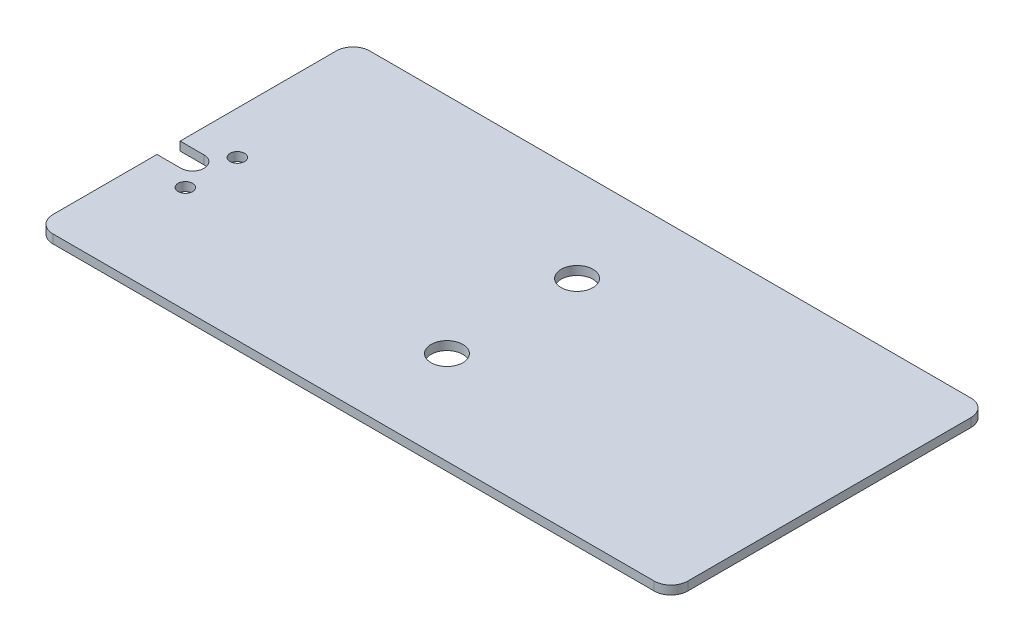
ISO-10303-21;
HEADER;
FILE_DESCRIPTION(('STEP AP214'),'2;1');
FILE_NAME('part.step','',(''),(''),'','','');
FILE_SCHEMA(('AUTOMOTIVE_DESIGN { 1 0 10303 214 1 1 1 1 }'));
ENDSEC;
DATA;
#1=APPLICATION_CONTEXT('core data for automotive mechanical design processes');
#2=APPLICATION_PROTOCOL_DEFINITION('international standard','automotive_design',2000,#1);
#3=PRODUCT_CONTEXT('',#1,'mechanical');
#4=PRODUCT('Part','Part','',(#3));
#5=PRODUCT_RELATED_PRODUCT_CATEGORY('part','',(#4));
#6=PRODUCT_DEFINITION_FORMATION('','',#4);
#7=PRODUCT_DEFINITION_CONTEXT('part definition',#1,'design');
#8=PRODUCT_DEFINITION('design','',#6,#7);
#9=PRODUCT_DEFINITION_SHAPE('','',#8);
#10=(LENGTH_UNIT() NAMED_UNIT(*) SI_UNIT(.MILLI.,.METRE.));
#11=(NAMED_UNIT(*) PLANE_ANGLE_UNIT() SI_UNIT($,.RADIAN.));
#12=(NAMED_UNIT(*) SI_UNIT($,.STERADIAN.) SOLID_ANGLE_UNIT());
#13=UNCERTAINTY_MEASURE_WITH_UNIT(LENGTH_MEASURE(1.E-05),#10,'distance_accuracy_value','');
#14=(GEOMETRIC_REPRESENTATION_CONTEXT(3) GLOBAL_UNCERTAINTY_ASSIGNED_CONTEXT((#13)) GLOBAL_UNIT_ASSIGNED_CONTEXT((#10,
#11,#12)) REPRESENTATION_CONTEXT('',''));
#15=CARTESIAN_POINT('',(0.,0.,0.));
#16=DIRECTION('',(0.,0.,1.));
#17=DIRECTION('',(1.,0.,0.));
#18=AXIS2_PLACEMENT_3D('',#15,#16,#17);
#19=CARTESIAN_POINT('',(0.,0.,0.));
#20=DIRECTION('',(0.,-1.,0.));
#21=DIRECTION('',(0.,0.,-1.));
#22=AXIS2_PLACEMENT_3D('',#19,#20,#21);
#23=PLANE('',#22);
#24=CARTESIAN_POINT('',(0.,0.,-22.5));
#25=DIRECTION('',(0.,1.,0.));
#26=DIRECTION('',(0.,0.,1.));
#27=AXIS2_PLACEMENT_3D('',#24,#25,#26);
#28=CIRCLE('',#27,5.5);
#29=CARTESIAN_POINT('',(0.,0.,-17.));
#30=VERTEX_POINT('',#29);
#31=EDGE_CURVE('E155',#30,#30,#28,.T.);
#32=ORIENTED_EDGE('',*,*,#31,.T.);
#33=EDGE_LOOP('',(#32));
#34=FACE_BOUND('',#33,.T.);
#35=CARTESIAN_POINT('',(0.,0.,22.5));
#36=DIRECTION('',(0.,1.,0.));
#37=DIRECTION('',(0.,0.,1.));
#38=AXIS2_PLACEMENT_3D('',#35,#36,#37);
#39=CIRCLE('',#38,5.5);
#40=CARTESIAN_POINT('',(0.,0.,28.));
#41=VERTEX_POINT('',#40);
#42=EDGE_CURVE('E313',#41,#41,#39,.T.);
#43=ORIENTED_EDGE('',*,*,#42,.T.);
#44=EDGE_LOOP('',(#43));
#45=FACE_BOUND('',#44,.T.);
#46=CARTESIAN_POINT('',(-95.,0.,0.));
#47=DIRECTION('',(0.,1.,0.));
#48=DIRECTION('',(0.,0.,1.));
#49=AXIS2_PLACEMENT_3D('',#46,#47,#48);
#50=CIRCLE('',#49,2.49999999999999);
#51=CARTESIAN_POINT('',(-95.,0.,2.5));
#52=VERTEX_POINT('',#51);
#53=EDGE_CURVE('E167',#52,#52,#50,.T.);
#54=ORIENTED_EDGE('',*,*,#53,.T.);
#55=EDGE_LOOP('',(#54));
#56=FACE_BOUND('',#55,.T.);
#57=CARTESIAN_POINT('',(-95.,0.,18.));
#58=DIRECTION('',(0.,1.,0.));
#59=DIRECTION('',(0.,0.,1.));
#60=AXIS2_PLACEMENT_3D('',#57,#58,#59);
#61=CIRCLE('',#60,2.49999999999999);
#62=CARTESIAN_POINT('',(-95.,0.,20.5));
#63=VERTEX_POINT('',#62);
#64=EDGE_CURVE('E326',#63,#63,#61,.T.);
#65=ORIENTED_EDGE('',*,*,#64,.T.);
#66=EDGE_LOOP('',(#65));
#67=FACE_BOUND('',#66,.T.);
#68=DIRECTION('',(0.,0.,-1.));
#69=VECTOR('',#68,1.);
#70=CARTESIAN_POINT('',(-109.8,0.,0.));
#71=LINE('',#70,#69);
#72=CARTESIAN_POINT('',(-109.8,0.,49.));
#73=VERTEX_POINT('',#72);
#74=CARTESIAN_POINT('',(-109.8,0.,13.));
#75=VERTEX_POINT('',#74);
#76=EDGE_CURVE('E144',#73,#75,#71,.T.);
#77=ORIENTED_EDGE('',*,*,#76,.T.);
#78=DIRECTION('',(-1.,0.,0.));
#79=VECTOR('',#78,1.);
#80=CARTESIAN_POINT('',(0.,0.,13.));
#81=LINE('',#80,#79);
#82=CARTESIAN_POINT('',(-101.5,0.,13.));
#83=VERTEX_POINT('',#82);
#84=EDGE_CURVE('E126',#83,#75,#81,.T.);
#85=ORIENTED_EDGE('',*,*,#84,.F.);
#86=CARTESIAN_POINT('',(-101.5,0.,9.00000000000001));
#87=DIRECTION('',(0.,1.,0.));
#88=DIRECTION('',(0.,0.,1.));
#89=AXIS2_PLACEMENT_3D('',#86,#87,#88);
#90=CIRCLE('',#89,4.);
#91=CARTESIAN_POINT('',(-101.5,0.,5.));
#92=VERTEX_POINT('',#91);
#93=EDGE_CURVE('E135',#83,#92,#90,.T.);
#94=ORIENTED_EDGE('',*,*,#93,.T.);
#95=DIRECTION('',(-1.,0.,0.));
#96=VECTOR('',#95,1.);
#97=CARTESIAN_POINT('',(0.,0.,5.));
#98=LINE('',#97,#96);
#99=CARTESIAN_POINT('',(-109.8,0.,5.));
#100=VERTEX_POINT('',#99);
#101=EDGE_CURVE('E132',#92,#100,#98,.T.);
#102=ORIENTED_EDGE('',*,*,#101,.T.);
#103=CARTESIAN_POINT('',(-109.8,0.,-49.));
#104=VERTEX_POINT('',#103);
#105=EDGE_CURVE('E173',#100,#104,#71,.T.);
#106=ORIENTED_EDGE('',*,*,#105,.T.);
#107=CARTESIAN_POINT('',(-104.,0.,-49.));
#108=DIRECTION('',(0.,-1.,0.));
#109=DIRECTION('',(0.,0.,-1.));
#110=AXIS2_PLACEMENT_3D('',#107,#108,#109);
#111=CIRCLE('',#110,5.8);
#112=CARTESIAN_POINT('',(-104.,0.,-54.8));
#113=VERTEX_POINT('',#112);
#114=EDGE_CURVE('E170',#104,#113,#111,.T.);
#115=ORIENTED_EDGE('',*,*,#114,.T.);
#116=DIRECTION('',(1.,0.,0.));
#117=VECTOR('',#116,1.);
#118=CARTESIAN_POINT('',(0.,0.,-54.8));
#119=LINE('',#118,#117);
#120=CARTESIAN_POINT('',(104.,0.,-54.8));
#121=VERTEX_POINT('',#120);
#122=EDGE_CURVE('E166',#113,#121,#119,.T.);
#123=ORIENTED_EDGE('',*,*,#122,.T.);
#124=CARTESIAN_POINT('',(104.,0.,-49.));
#125=DIRECTION('',(0.,-1.,0.));
#126=DIRECTION('',(0.,0.,-1.));
#127=AXIS2_PLACEMENT_3D('',#124,#125,#126);
#128=CIRCLE('',#127,5.79999999999999);
#129=CARTESIAN_POINT('',(109.8,0.,-49.));
#130=VERTEX_POINT('',#129);
#131=EDGE_CURVE('E163',#121,#130,#128,.T.);
#132=ORIENTED_EDGE('',*,*,#131,.T.);
#133=DIRECTION('',(0.,0.,1.));
#134=VECTOR('',#133,1.);
#135=CARTESIAN_POINT('',(109.8,0.,0.));
#136=LINE('',#135,#134);
#137=CARTESIAN_POINT('',(109.8,0.,49.));
#138=VERTEX_POINT('',#137);
#139=EDGE_CURVE('E183',#130,#138,#136,.T.);
#140=ORIENTED_EDGE('',*,*,#139,.T.);
#141=CARTESIAN_POINT('',(104.,0.,49.));
#142=DIRECTION('',(0.,-1.,0.));
#143=DIRECTION('',(0.,0.,-1.));
#144=AXIS2_PLACEMENT_3D('',#141,#142,#143);
#145=CIRCLE('',#144,5.8);
#146=CARTESIAN_POINT('',(104.,0.,54.8));
#147=VERTEX_POINT('',#146);
#148=EDGE_CURVE('E180',#138,#147,#145,.T.);
#149=ORIENTED_EDGE('',*,*,#148,.T.);
#150=DIRECTION('',(-1.,0.,0.));
#151=VECTOR('',#150,1.);
#152=CARTESIAN_POINT('',(0.,0.,54.8));
#153=LINE('',#152,#151);
#154=CARTESIAN_POINT('',(-104.,0.,54.8));
#155=VERTEX_POINT('',#154);
#156=EDGE_CURVE('E177',#147,#155,#153,.T.);
#157=ORIENTED_EDGE('',*,*,#156,.T.);
#158=CARTESIAN_POINT('',(-104.,0.,49.));
#159=DIRECTION('',(0.,-1.,0.));
#160=DIRECTION('',(0.,0.,-1.));
#161=AXIS2_PLACEMENT_3D('',#158,#159,#160);
#162=CIRCLE('',#161,5.79999999999999);
#163=EDGE_CURVE('E175',#155,#73,#162,.T.);
#164=ORIENTED_EDGE('',*,*,#163,.T.);
#165=EDGE_LOOP('',(#77,#85,#94,#102,#106,#115,#123,#132,#140,#149,#157,#164));
#166=FACE_BOUND('',#165,.T.);
#167=ADVANCED_FACE('F38',(#34,#45,#56,#67,#166),#23,.T.);
#168=CARTESIAN_POINT('',(-109.8,10.,0.));
#169=DIRECTION('',(-1.,0.,0.));
#170=DIRECTION('',(0.,0.,1.));
#171=AXIS2_PLACEMENT_3D('',#168,#169,#170);
#172=PLANE('',#171);
#173=DIRECTION('',(0.,0.,-1.));
#174=VECTOR('',#173,1.);
#175=CARTESIAN_POINT('',(-109.8,3.,0.));
#176=LINE('',#175,#174);
#177=CARTESIAN_POINT('',(-109.8,3.,49.));
#178=VERTEX_POINT('',#177);
#179=CARTESIAN_POINT('',(-109.8,3.,13.));
#180=VERTEX_POINT('',#179);
#181=EDGE_CURVE('E208',#178,#180,#176,.T.);
#182=ORIENTED_EDGE('',*,*,#181,.T.);
#183=DIRECTION('',(0.,1.,0.));
#184=VECTOR('',#183,1.);
#185=CARTESIAN_POINT('',(-109.8,0.,13.));
#186=LINE('',#185,#184);
#187=EDGE_CURVE('E157',#75,#180,#186,.T.);
#188=ORIENTED_EDGE('',*,*,#187,.F.);
#189=ORIENTED_EDGE('',*,*,#76,.F.);
#190=DIRECTION('',(0.,-1.,0.));
#191=VECTOR('',#190,1.);
#192=CARTESIAN_POINT('',(-109.8,10.,49.));
#193=LINE('',#192,#191);
#194=EDGE_CURVE('E196',#178,#73,#193,.T.);
#195=ORIENTED_EDGE('',*,*,#194,.F.);
#196=EDGE_LOOP('',(#182,#188,#189,#195));
#197=FACE_BOUND('',#196,.T.);
#198=ADVANCED_FACE('F259',(#197),#172,.T.);
#199=CARTESIAN_POINT('',(0.,3.,0.));
#200=DIRECTION('',(0.,-1.,0.));
#201=DIRECTION('',(0.,0.,-1.));
#202=AXIS2_PLACEMENT_3D('',#199,#200,#201);
#203=PLANE('',#202);
#204=CARTESIAN_POINT('',(0.,3.,-22.5));
#205=DIRECTION('',(0.,1.,0.));
#206=DIRECTION('',(0.,0.,1.));
#207=AXIS2_PLACEMENT_3D('',#204,#205,#206);
#208=CIRCLE('',#207,5.5);
#209=CARTESIAN_POINT('',(0.,3.,-17.));
#210=VERTEX_POINT('',#209);
#211=EDGE_CURVE('E312',#210,#210,#208,.T.);
#212=ORIENTED_EDGE('',*,*,#211,.F.);
#213=EDGE_LOOP('',(#212));
#214=FACE_BOUND('',#213,.T.);
#215=CARTESIAN_POINT('',(0.,3.,22.5));
#216=DIRECTION('',(0.,1.,0.));
#217=DIRECTION('',(0.,0.,1.));
#218=AXIS2_PLACEMENT_3D('',#215,#216,#217);
#219=CIRCLE('',#218,5.5);
#220=CARTESIAN_POINT('',(0.,3.,28.));
#221=VERTEX_POINT('',#220);
#222=EDGE_CURVE('E317',#221,#221,#219,.T.);
#223=ORIENTED_EDGE('',*,*,#222,.F.);
#224=EDGE_LOOP('',(#223));
#225=FACE_BOUND('',#224,.T.);
#226=CARTESIAN_POINT('',(-95.,3.,0.));
#227=DIRECTION('',(0.,1.,0.));
#228=DIRECTION('',(0.,0.,1.));
#229=AXIS2_PLACEMENT_3D('',#226,#227,#228);
#230=CIRCLE('',#229,2.49999999999999);
#231=CARTESIAN_POINT('',(-95.,3.,2.5));
#232=VERTEX_POINT('',#231);
#233=EDGE_CURVE('E324',#232,#232,#230,.T.);
#234=ORIENTED_EDGE('',*,*,#233,.F.);
#235=EDGE_LOOP('',(#234));
#236=FACE_BOUND('',#235,.T.);
#237=CARTESIAN_POINT('',(-95.,3.,18.));
#238=DIRECTION('',(0.,1.,0.));
#239=DIRECTION('',(0.,0.,1.));
#240=AXIS2_PLACEMENT_3D('',#237,#238,#239);
#241=CIRCLE('',#240,2.49999999999999);
#242=CARTESIAN_POINT('',(-95.,3.,20.5));
#243=VERTEX_POINT('',#242);
#244=EDGE_CURVE('E150',#243,#243,#241,.T.);
#245=ORIENTED_EDGE('',*,*,#244,.F.);
#246=EDGE_LOOP('',(#245));
#247=FACE_BOUND('',#246,.T.);
#248=DIRECTION('',(-1.,0.,0.));
#249=VECTOR('',#248,1.);
#250=CARTESIAN_POINT('',(0.,3.,13.));
#251=LINE('',#250,#249);
#252=CARTESIAN_POINT('',(-101.5,3.,13.));
#253=VERTEX_POINT('',#252);
#254=EDGE_CURVE('E52',#253,#180,#251,.T.);
#255=ORIENTED_EDGE('',*,*,#254,.T.);
#256=ORIENTED_EDGE('',*,*,#181,.F.);
#257=CARTESIAN_POINT('',(-104.,3.,49.));
#258=DIRECTION('',(0.,-1.,0.));
#259=DIRECTION('',(0.,0.,-1.));
#260=AXIS2_PLACEMENT_3D('',#257,#258,#259);
#261=CIRCLE('',#260,5.79999999999999);
#262=CARTESIAN_POINT('',(-104.,3.,54.8));
#263=VERTEX_POINT('',#262);
#264=EDGE_CURVE('E211',#263,#178,#261,.T.);
#265=ORIENTED_EDGE('',*,*,#264,.F.);
#266=DIRECTION('',(-1.,0.,0.));
#267=VECTOR('',#266,1.);
#268=CARTESIAN_POINT('',(0.,3.,54.8));
#269=LINE('',#268,#267);
#270=CARTESIAN_POINT('',(104.,3.,54.8));
#271=VERTEX_POINT('',#270);
#272=EDGE_CURVE('E213',#271,#263,#269,.T.);
#273=ORIENTED_EDGE('',*,*,#272,.F.);
#274=CARTESIAN_POINT('',(104.,3.,49.));
#275=DIRECTION('',(0.,-1.,0.));
#276=DIRECTION('',(0.,0.,-1.));
#277=AXIS2_PLACEMENT_3D('',#274,#275,#276);
#278=CIRCLE('',#277,5.8);
#279=CARTESIAN_POINT('',(109.8,3.,49.));
#280=VERTEX_POINT('',#279);
#281=EDGE_CURVE('E215',#280,#271,#278,.T.);
#282=ORIENTED_EDGE('',*,*,#281,.F.);
#283=DIRECTION('',(0.,0.,1.));
#284=VECTOR('',#283,1.);
#285=CARTESIAN_POINT('',(109.8,3.,0.));
#286=LINE('',#285,#284);
#287=CARTESIAN_POINT('',(109.8,3.,-49.));
#288=VERTEX_POINT('',#287);
#289=EDGE_CURVE('E45',#288,#280,#286,.T.);
#290=ORIENTED_EDGE('',*,*,#289,.F.);
#291=CARTESIAN_POINT('',(104.,3.,-49.));
#292=DIRECTION('',(0.,-1.,0.));
#293=DIRECTION('',(0.,0.,-1.));
#294=AXIS2_PLACEMENT_3D('',#291,#292,#293);
#295=CIRCLE('',#294,5.79999999999999);
#296=CARTESIAN_POINT('',(104.,3.,-54.8));
#297=VERTEX_POINT('',#296);
#298=EDGE_CURVE('E11',#297,#288,#295,.T.);
#299=ORIENTED_EDGE('',*,*,#298,.F.);
#300=DIRECTION('',(1.,0.,0.));
#301=VECTOR('',#300,1.);
#302=CARTESIAN_POINT('',(0.,3.,-54.8));
#303=LINE('',#302,#301);
#304=CARTESIAN_POINT('',(-104.,3.,-54.8));
#305=VERTEX_POINT('',#304);
#306=EDGE_CURVE('E189',#305,#297,#303,.T.);
#307=ORIENTED_EDGE('',*,*,#306,.F.);
#308=CARTESIAN_POINT('',(-104.,3.,-49.));
#309=DIRECTION('',(0.,-1.,0.));
#310=DIRECTION('',(0.,0.,-1.));
#311=AXIS2_PLACEMENT_3D('',#308,#309,#310);
#312=CIRCLE('',#311,5.8);
#313=CARTESIAN_POINT('',(-109.8,3.,-49.));
#314=VERTEX_POINT('',#313);
#315=EDGE_CURVE('E205',#314,#305,#312,.T.);
#316=ORIENTED_EDGE('',*,*,#315,.F.);
#317=CARTESIAN_POINT('',(-109.8,3.,5.));
#318=VERTEX_POINT('',#317);
#319=EDGE_CURVE('E207',#318,#314,#176,.T.);
#320=ORIENTED_EDGE('',*,*,#319,.F.);
#321=DIRECTION('',(-1.,0.,0.));
#322=VECTOR('',#321,1.);
#323=CARTESIAN_POINT('',(0.,3.,5.));
#324=LINE('',#323,#322);
#325=CARTESIAN_POINT('',(-101.5,3.,5.));
#326=VERTEX_POINT('',#325);
#327=EDGE_CURVE('E145',#326,#318,#324,.T.);
#328=ORIENTED_EDGE('',*,*,#327,.F.);
#329=CARTESIAN_POINT('',(-101.5,3.,9.00000000000001));
#330=DIRECTION('',(0.,1.,0.));
#331=DIRECTION('',(0.,0.,1.));
#332=AXIS2_PLACEMENT_3D('',#329,#330,#331);
#333=CIRCLE('',#332,4.);
#334=EDGE_CURVE('E147',#253,#326,#333,.T.);
#335=ORIENTED_EDGE('',*,*,#334,.F.);
#336=EDGE_LOOP('',(#255,#256,#265,#273,#282,#290,#299,#307,#316,#320,#328,#335));
#337=FACE_BOUND('',#336,.T.);
#338=ADVANCED_FACE('F230',(#214,#225,#236,#247,#337),#203,.F.);
#339=CARTESIAN_POINT('',(104.,10.,-49.));
#340=DIRECTION('',(0.,-1.,0.));
#341=DIRECTION('',(0.,0.,-1.));
#342=AXIS2_PLACEMENT_3D('',#339,#340,#341);
#343=CYLINDRICAL_SURFACE('',#342,5.79999999999999);
#344=ORIENTED_EDGE('',*,*,#298,.T.);
#345=DIRECTION('',(0.,-1.,0.));
#346=VECTOR('',#345,1.);
#347=CARTESIAN_POINT('',(109.8,10.,-49.));
#348=LINE('',#347,#346);
#349=EDGE_CURVE('E187',#288,#130,#348,.T.);
#350=ORIENTED_EDGE('',*,*,#349,.T.);
#351=ORIENTED_EDGE('',*,*,#131,.F.);
#352=DIRECTION('',(0.,-1.,0.));
#353=VECTOR('',#352,1.);
#354=CARTESIAN_POINT('',(104.,10.,-54.8));
#355=LINE('',#354,#353);
#356=EDGE_CURVE('E186',#297,#121,#355,.T.);
#357=ORIENTED_EDGE('',*,*,#356,.F.);
#358=EDGE_LOOP('',(#344,#350,#351,#357));
#359=FACE_BOUND('',#358,.T.);
#360=ADVANCED_FACE('F243',(#359),#343,.T.);
#361=CARTESIAN_POINT('',(109.8,10.,0.));
#362=DIRECTION('',(1.,0.,0.));
#363=DIRECTION('',(0.,0.,-1.));
#364=AXIS2_PLACEMENT_3D('',#361,#362,#363);
#365=PLANE('',#364);
#366=ORIENTED_EDGE('',*,*,#289,.T.);
#367=DIRECTION('',(0.,-1.,0.));
#368=VECTOR('',#367,1.);
#369=CARTESIAN_POINT('',(109.8,10.,49.));
#370=LINE('',#369,#368);
#371=EDGE_CURVE('E190',#280,#138,#370,.T.);
#372=ORIENTED_EDGE('',*,*,#371,.T.);
#373=ORIENTED_EDGE('',*,*,#139,.F.);
#374=ORIENTED_EDGE('',*,*,#349,.F.);
#375=EDGE_LOOP('',(#366,#372,#373,#374));
#376=FACE_BOUND('',#375,.T.);
#377=ADVANCED_FACE('F220',(#376),#365,.T.);
#378=CARTESIAN_POINT('',(104.,10.,49.));
#379=DIRECTION('',(0.,-1.,0.));
#380=DIRECTION('',(0.,0.,-1.));
#381=AXIS2_PLACEMENT_3D('',#378,#379,#380);
#382=CYLINDRICAL_SURFACE('',#381,5.8);
#383=ORIENTED_EDGE('',*,*,#281,.T.);
#384=DIRECTION('',(0.,-1.,0.));
#385=VECTOR('',#384,1.);
#386=CARTESIAN_POINT('',(104.,10.,54.8));
#387=LINE('',#386,#385);
#388=EDGE_CURVE('E192',#271,#147,#387,.T.);
#389=ORIENTED_EDGE('',*,*,#388,.T.);
#390=ORIENTED_EDGE('',*,*,#148,.F.);
#391=ORIENTED_EDGE('',*,*,#371,.F.);
#392=EDGE_LOOP('',(#383,#389,#390,#391));
#393=FACE_BOUND('',#392,.T.);
#394=ADVANCED_FACE('F227',(#393),#382,.T.);
#395=CARTESIAN_POINT('',(0.,10.,54.8));
#396=DIRECTION('',(0.,0.,1.));
#397=DIRECTION('',(1.,0.,0.));
#398=AXIS2_PLACEMENT_3D('',#395,#396,#397);
#399=PLANE('',#398);
#400=ORIENTED_EDGE('',*,*,#272,.T.);
#401=DIRECTION('',(0.,-1.,0.));
#402=VECTOR('',#401,1.);
#403=CARTESIAN_POINT('',(-104.,10.,54.8));
#404=LINE('',#403,#402);
#405=EDGE_CURVE('E194',#263,#155,#404,.T.);
#406=ORIENTED_EDGE('',*,*,#405,.T.);
#407=ORIENTED_EDGE('',*,*,#156,.F.);
#408=ORIENTED_EDGE('',*,*,#388,.F.);
#409=EDGE_LOOP('',(#400,#406,#407,#408));
#410=FACE_BOUND('',#409,.T.);
#411=ADVANCED_FACE('F235',(#410),#399,.T.);
#412=CARTESIAN_POINT('',(-104.,10.,49.));
#413=DIRECTION('',(0.,-1.,0.));
#414=DIRECTION('',(0.,0.,-1.));
#415=AXIS2_PLACEMENT_3D('',#412,#413,#414);
#416=CYLINDRICAL_SURFACE('',#415,5.79999999999999);
#417=ORIENTED_EDGE('',*,*,#264,.T.);
#418=ORIENTED_EDGE('',*,*,#194,.T.);
#419=ORIENTED_EDGE('',*,*,#163,.F.);
#420=ORIENTED_EDGE('',*,*,#405,.F.);
#421=EDGE_LOOP('',(#417,#418,#419,#420));
#422=FACE_BOUND('',#421,.T.);
#423=ADVANCED_FACE('F239',(#422),#416,.T.);
#424=DIRECTION('',(0.,1.,0.));
#425=VECTOR('',#424,1.);
#426=CARTESIAN_POINT('',(-109.8,0.,5.));
#427=LINE('',#426,#425);
#428=EDGE_CURVE('E159',#100,#318,#427,.T.);
#429=ORIENTED_EDGE('',*,*,#428,.T.);
#430=ORIENTED_EDGE('',*,*,#319,.T.);
#431=DIRECTION('',(0.,-1.,0.));
#432=VECTOR('',#431,1.);
#433=CARTESIAN_POINT('',(-109.8,10.,-49.));
#434=LINE('',#433,#432);
#435=EDGE_CURVE('E198',#314,#104,#434,.T.);
#436=ORIENTED_EDGE('',*,*,#435,.T.);
#437=ORIENTED_EDGE('',*,*,#105,.F.);
#438=EDGE_LOOP('',(#429,#430,#436,#437));
#439=FACE_BOUND('',#438,.T.);
#440=ADVANCED_FACE('F255',(#439),#172,.T.);
#441=CARTESIAN_POINT('',(-104.,10.,-49.));
#442=DIRECTION('',(0.,-1.,0.));
#443=DIRECTION('',(0.,0.,-1.));
#444=AXIS2_PLACEMENT_3D('',#441,#442,#443);
#445=CYLINDRICAL_SURFACE('',#444,5.8);
#446=ORIENTED_EDGE('',*,*,#315,.T.);
#447=DIRECTION('',(0.,-1.,0.));
#448=VECTOR('',#447,1.);
#449=CARTESIAN_POINT('',(-104.,10.,-54.8));
#450=LINE('',#449,#448);
#451=EDGE_CURVE('E60',#305,#113,#450,.T.);
#452=ORIENTED_EDGE('',*,*,#451,.T.);
#453=ORIENTED_EDGE('',*,*,#114,.F.);
#454=ORIENTED_EDGE('',*,*,#435,.F.);
#455=EDGE_LOOP('',(#446,#452,#453,#454));
#456=FACE_BOUND('',#455,.T.);
#457=ADVANCED_FACE('F251',(#456),#445,.T.);
#458=CARTESIAN_POINT('',(0.,10.,-54.8));
#459=DIRECTION('',(0.,0.,-1.));
#460=DIRECTION('',(-1.,0.,0.));
#461=AXIS2_PLACEMENT_3D('',#458,#459,#460);
#462=PLANE('',#461);
#463=ORIENTED_EDGE('',*,*,#306,.T.);
#464=ORIENTED_EDGE('',*,*,#356,.T.);
#465=ORIENTED_EDGE('',*,*,#122,.F.);
#466=ORIENTED_EDGE('',*,*,#451,.F.);
#467=EDGE_LOOP('',(#463,#464,#465,#466));
#468=FACE_BOUND('',#467,.T.);
#469=ADVANCED_FACE('F244',(#468),#462,.T.);
#470=CARTESIAN_POINT('',(0.,0.,13.));
#471=DIRECTION('',(0.,0.,-1.));
#472=DIRECTION('',(-1.,0.,0.));
#473=AXIS2_PLACEMENT_3D('',#470,#471,#472);
#474=PLANE('',#473);
#475=ORIENTED_EDGE('',*,*,#254,.F.);
#476=DIRECTION('',(0.,1.,0.));
#477=VECTOR('',#476,1.);
#478=CARTESIAN_POINT('',(-101.5,0.,13.));
#479=LINE('',#478,#477);
#480=EDGE_CURVE('E122',#83,#253,#479,.T.);
#481=ORIENTED_EDGE('',*,*,#480,.F.);
#482=ORIENTED_EDGE('',*,*,#84,.T.);
#483=ORIENTED_EDGE('',*,*,#187,.T.);
#484=EDGE_LOOP('',(#475,#481,#482,#483));
#485=FACE_BOUND('',#484,.T.);
#486=ADVANCED_FACE('F124',(#485),#474,.T.);
#487=CARTESIAN_POINT('',(0.,0.,5.));
#488=DIRECTION('',(0.,0.,-1.));
#489=DIRECTION('',(-1.,0.,0.));
#490=AXIS2_PLACEMENT_3D('',#487,#488,#489);
#491=PLANE('',#490);
#492=ORIENTED_EDGE('',*,*,#327,.T.);
#493=ORIENTED_EDGE('',*,*,#428,.F.);
#494=ORIENTED_EDGE('',*,*,#101,.F.);
#495=DIRECTION('',(0.,1.,0.));
#496=VECTOR('',#495,1.);
#497=CARTESIAN_POINT('',(-101.5,0.,5.));
#498=LINE('',#497,#496);
#499=EDGE_CURVE('E131',#92,#326,#498,.T.);
#500=ORIENTED_EDGE('',*,*,#499,.T.);
#501=EDGE_LOOP('',(#492,#493,#494,#500));
#502=FACE_BOUND('',#501,.T.);
#503=ADVANCED_FACE('F257',(#502),#491,.F.);
#504=CARTESIAN_POINT('',(-101.5,0.,9.00000000000001));
#505=DIRECTION('',(0.,1.,0.));
#506=DIRECTION('',(0.,0.,1.));
#507=AXIS2_PLACEMENT_3D('',#504,#505,#506);
#508=CYLINDRICAL_SURFACE('',#507,4.);
#509=ORIENTED_EDGE('',*,*,#334,.T.);
#510=ORIENTED_EDGE('',*,*,#499,.F.);
#511=ORIENTED_EDGE('',*,*,#93,.F.);
#512=ORIENTED_EDGE('',*,*,#480,.T.);
#513=EDGE_LOOP('',(#509,#510,#511,#512));
#514=FACE_BOUND('',#513,.T.);
#515=ADVANCED_FACE('F136',(#514),#508,.F.);
#516=CARTESIAN_POINT('',(-95.,0.,18.));
#517=DIRECTION('',(0.,1.,0.));
#518=DIRECTION('',(0.,0.,1.));
#519=AXIS2_PLACEMENT_3D('',#516,#517,#518);
#520=CYLINDRICAL_SURFACE('',#519,2.49999999999999);
#521=ORIENTED_EDGE('',*,*,#64,.F.);
#522=EDGE_LOOP('',(#521));
#523=FACE_BOUND('',#522,.T.);
#524=ORIENTED_EDGE('',*,*,#244,.T.);
#525=EDGE_LOOP('',(#524));
#526=FACE_BOUND('',#525,.T.);
#527=ADVANCED_FACE('F288',(#523,#526),#520,.F.);
#528=CARTESIAN_POINT('',(-95.,0.,0.));
#529=DIRECTION('',(0.,1.,0.));
#530=DIRECTION('',(0.,0.,1.));
#531=AXIS2_PLACEMENT_3D('',#528,#529,#530);
#532=CYLINDRICAL_SURFACE('',#531,2.49999999999999);
#533=ORIENTED_EDGE('',*,*,#53,.F.);
#534=EDGE_LOOP('',(#533));
#535=FACE_BOUND('',#534,.T.);
#536=ORIENTED_EDGE('',*,*,#233,.T.);
#537=EDGE_LOOP('',(#536));
#538=FACE_BOUND('',#537,.T.);
#539=ADVANCED_FACE('F293',(#535,#538),#532,.F.);
#540=CARTESIAN_POINT('',(0.,0.,22.5));
#541=DIRECTION('',(0.,1.,0.));
#542=DIRECTION('',(0.,0.,1.));
#543=AXIS2_PLACEMENT_3D('',#540,#541,#542);
#544=CYLINDRICAL_SURFACE('',#543,5.5);
#545=ORIENTED_EDGE('',*,*,#42,.F.);
#546=EDGE_LOOP('',(#545));
#547=FACE_BOUND('',#546,.T.);
#548=ORIENTED_EDGE('',*,*,#222,.T.);
#549=EDGE_LOOP('',(#548));
#550=FACE_BOUND('',#549,.T.);
#551=ADVANCED_FACE('F297',(#547,#550),#544,.F.);
#552=CARTESIAN_POINT('',(0.,0.,-22.5));
#553=DIRECTION('',(0.,1.,0.));
#554=DIRECTION('',(0.,0.,1.));
#555=AXIS2_PLACEMENT_3D('',#552,#553,#554);
#556=CYLINDRICAL_SURFACE('',#555,5.5);
#557=ORIENTED_EDGE('',*,*,#31,.F.);
#558=EDGE_LOOP('',(#557));
#559=FACE_BOUND('',#558,.T.);
#560=ORIENTED_EDGE('',*,*,#211,.T.);
#561=EDGE_LOOP('',(#560));
#562=FACE_BOUND('',#561,.T.);
#563=ADVANCED_FACE('F301',(#559,#562),#556,.F.);
#564=CLOSED_SHELL('',(#167,#198,#338,#360,#377,#394,#411,#423,#440,#457,#469,#486,#503,#515,
#527,#539,#551,#563));
#565=MANIFOLD_SOLID_BREP('B2',#564);
#566=ADVANCED_BREP_SHAPE_REPRESENTATION('',(#18,#565),#14);
#567=SHAPE_DEFINITION_REPRESENTATION(#9,#566);
ENDSEC;
END-ISO-10303-21;
